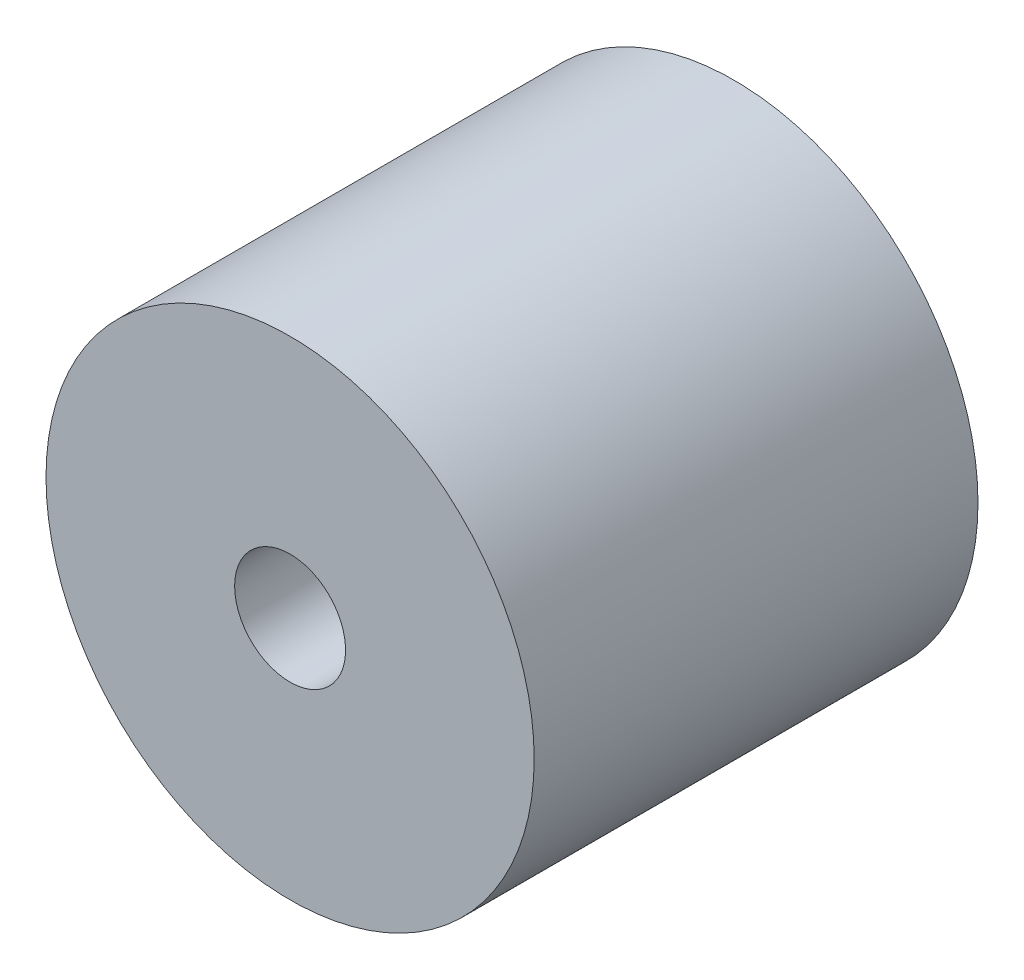
ISO-10303-21;
HEADER;
FILE_DESCRIPTION(('STEP AP214'),'2;1');
FILE_NAME('part.step','',(''),(''),'','','');
FILE_SCHEMA(('AUTOMOTIVE_DESIGN { 1 0 10303 214 1 1 1 1 }'));
ENDSEC;
DATA;
#1=APPLICATION_CONTEXT('core data for automotive mechanical design processes');
#2=APPLICATION_PROTOCOL_DEFINITION('international standard','automotive_design',2000,#1);
#3=PRODUCT_CONTEXT('',#1,'mechanical');
#4=PRODUCT('Part','Part','',(#3));
#5=PRODUCT_RELATED_PRODUCT_CATEGORY('part','',(#4));
#6=PRODUCT_DEFINITION_FORMATION('','',#4);
#7=PRODUCT_DEFINITION_CONTEXT('part definition',#1,'design');
#8=PRODUCT_DEFINITION('design','',#6,#7);
#9=PRODUCT_DEFINITION_SHAPE('','',#8);
#10=(LENGTH_UNIT() NAMED_UNIT(*) SI_UNIT(.MILLI.,.METRE.));
#11=(NAMED_UNIT(*) PLANE_ANGLE_UNIT() SI_UNIT($,.RADIAN.));
#12=(NAMED_UNIT(*) SI_UNIT($,.STERADIAN.) SOLID_ANGLE_UNIT());
#13=UNCERTAINTY_MEASURE_WITH_UNIT(LENGTH_MEASURE(1.E-05),#10,'distance_accuracy_value','');
#14=(GEOMETRIC_REPRESENTATION_CONTEXT(3) GLOBAL_UNCERTAINTY_ASSIGNED_CONTEXT((#13)) GLOBAL_UNIT_ASSIGNED_CONTEXT((#10,
#11,#12)) REPRESENTATION_CONTEXT('',''));
#15=CARTESIAN_POINT('',(0.,0.,0.));
#16=DIRECTION('',(0.,0.,1.));
#17=DIRECTION('',(1.,0.,0.));
#18=AXIS2_PLACEMENT_3D('',#15,#16,#17);
#19=CARTESIAN_POINT('',(0.,0.,20.));
#20=DIRECTION('',(0.,0.,-1.));
#21=DIRECTION('',(-1.,0.,0.));
#22=AXIS2_PLACEMENT_3D('',#19,#20,#21);
#23=CYLINDRICAL_SURFACE('',#22,11.);
#24=CARTESIAN_POINT('',(0.,0.,20.));
#25=DIRECTION('',(0.,0.,1.));
#26=DIRECTION('',(1.,0.,0.));
#27=AXIS2_PLACEMENT_3D('',#24,#25,#26);
#28=CIRCLE('',#27,11.);
#29=CARTESIAN_POINT('',(11.,0.,20.));
#30=VERTEX_POINT('',#29);
#31=EDGE_CURVE('E10',#30,#30,#28,.T.);
#32=ORIENTED_EDGE('',*,*,#31,.F.);
#33=EDGE_LOOP('',(#32));
#34=FACE_BOUND('',#33,.T.);
#35=CARTESIAN_POINT('',(0.,0.,0.));
#36=DIRECTION('',(0.,0.,1.));
#37=DIRECTION('',(1.,0.,0.));
#38=AXIS2_PLACEMENT_3D('',#35,#36,#37);
#39=CIRCLE('',#38,11.);
#40=CARTESIAN_POINT('',(11.,0.,0.));
#41=VERTEX_POINT('',#40);
#42=EDGE_CURVE('E36',#41,#41,#39,.T.);
#43=ORIENTED_EDGE('',*,*,#42,.T.);
#44=EDGE_LOOP('',(#43));
#45=FACE_BOUND('',#44,.T.);
#46=ADVANCED_FACE('F33',(#34,#45),#23,.T.);
#47=CARTESIAN_POINT('',(0.,0.,20.));
#48=DIRECTION('',(0.,0.,1.));
#49=DIRECTION('',(1.,0.,0.));
#50=AXIS2_PLACEMENT_3D('',#47,#48,#49);
#51=PLANE('',#50);
#52=CARTESIAN_POINT('',(0.,0.,20.));
#53=DIRECTION('',(0.,0.,-1.));
#54=DIRECTION('',(-1.,0.,0.));
#55=AXIS2_PLACEMENT_3D('',#52,#53,#54);
#56=CIRCLE('',#55,2.5);
#57=CARTESIAN_POINT('',(-2.5,0.,20.));
#58=VERTEX_POINT('',#57);
#59=EDGE_CURVE('E43',#58,#58,#56,.T.);
#60=ORIENTED_EDGE('',*,*,#59,.T.);
#61=EDGE_LOOP('',(#60));
#62=FACE_BOUND('',#61,.T.);
#63=ORIENTED_EDGE('',*,*,#31,.T.);
#64=EDGE_LOOP('',(#63));
#65=FACE_BOUND('',#64,.T.);
#66=ADVANCED_FACE('F51',(#62,#65),#51,.T.);
#67=CARTESIAN_POINT('',(0.,0.,0.));
#68=DIRECTION('',(0.,0.,1.));
#69=DIRECTION('',(1.,0.,0.));
#70=AXIS2_PLACEMENT_3D('',#67,#68,#69);
#71=PLANE('',#70);
#72=CARTESIAN_POINT('',(0.,0.,0.));
#73=DIRECTION('',(0.,0.,-1.));
#74=DIRECTION('',(-1.,0.,0.));
#75=AXIS2_PLACEMENT_3D('',#72,#73,#74);
#76=CIRCLE('',#75,2.5);
#77=CARTESIAN_POINT('',(-2.5,0.,0.));
#78=VERTEX_POINT('',#77);
#79=EDGE_CURVE('E45',#78,#78,#76,.T.);
#80=ORIENTED_EDGE('',*,*,#79,.F.);
#81=EDGE_LOOP('',(#80));
#82=FACE_BOUND('',#81,.T.);
#83=ORIENTED_EDGE('',*,*,#42,.F.);
#84=EDGE_LOOP('',(#83));
#85=FACE_BOUND('',#84,.T.);
#86=ADVANCED_FACE('F56',(#82,#85),#71,.F.);
#87=CARTESIAN_POINT('',(0.,0.,20.));
#88=DIRECTION('',(0.,0.,-1.));
#89=DIRECTION('',(-1.,0.,0.));
#90=AXIS2_PLACEMENT_3D('',#87,#88,#89);
#91=CYLINDRICAL_SURFACE('',#90,2.5);
#92=ORIENTED_EDGE('',*,*,#59,.F.);
#93=EDGE_LOOP('',(#92));
#94=FACE_BOUND('',#93,.T.);
#95=ORIENTED_EDGE('',*,*,#79,.T.);
#96=EDGE_LOOP('',(#95));
#97=FACE_BOUND('',#96,.T.);
#98=ADVANCED_FACE('F53',(#94,#97),#91,.F.);
#99=CLOSED_SHELL('',(#46,#66,#86,#98));
#100=MANIFOLD_SOLID_BREP('B2',#99);
#101=ADVANCED_BREP_SHAPE_REPRESENTATION('',(#18,#100),#14);
#102=SHAPE_DEFINITION_REPRESENTATION(#9,#101);
ENDSEC;
END-ISO-10303-21;
